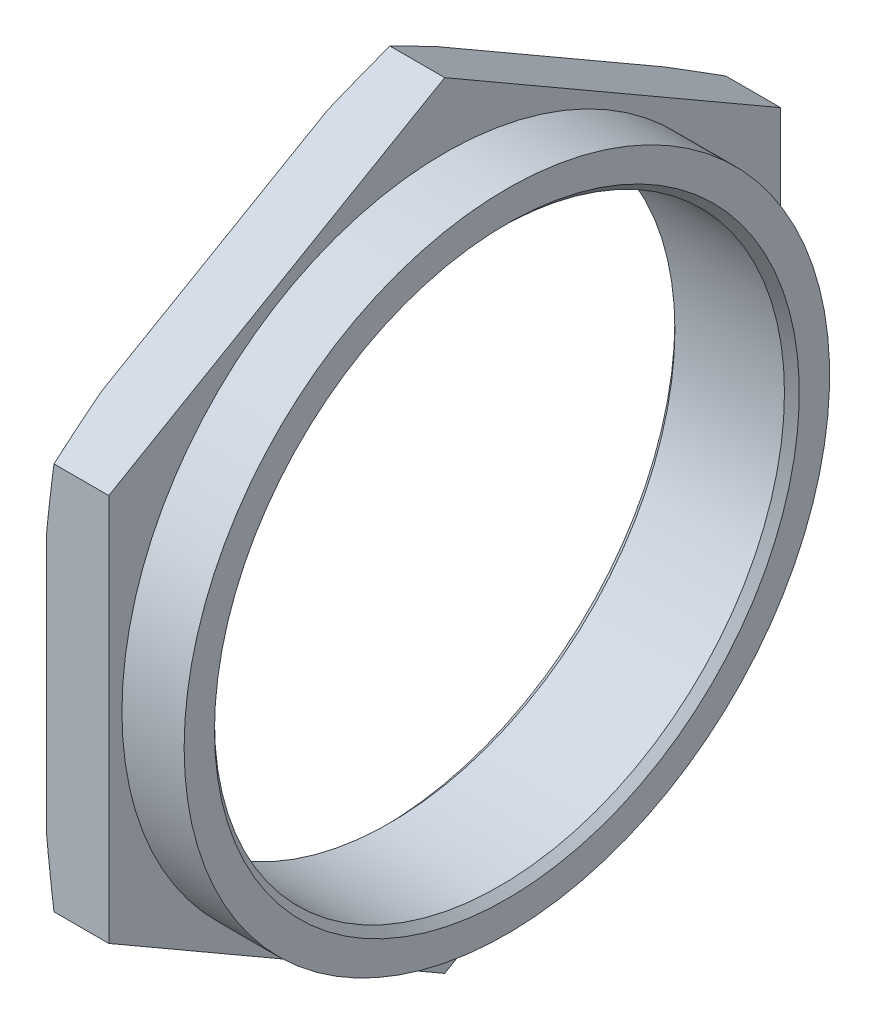
ISO-10303-21;
HEADER;
FILE_DESCRIPTION(('STEP AP214'),'2;1');
FILE_NAME('part.step','',(''),(''),'','','');
FILE_SCHEMA(('AUTOMOTIVE_DESIGN { 1 0 10303 214 1 1 1 1 }'));
ENDSEC;
DATA;
#1=APPLICATION_CONTEXT('core data for automotive mechanical design processes');
#2=APPLICATION_PROTOCOL_DEFINITION('international standard','automotive_design',2000,#1);
#3=PRODUCT_CONTEXT('',#1,'mechanical');
#4=PRODUCT('Part','Part','',(#3));
#5=PRODUCT_RELATED_PRODUCT_CATEGORY('part','',(#4));
#6=PRODUCT_DEFINITION_FORMATION('','',#4);
#7=PRODUCT_DEFINITION_CONTEXT('part definition',#1,'design');
#8=PRODUCT_DEFINITION('design','',#6,#7);
#9=PRODUCT_DEFINITION_SHAPE('','',#8);
#10=(LENGTH_UNIT() NAMED_UNIT(*) SI_UNIT(.MILLI.,.METRE.));
#11=(NAMED_UNIT(*) PLANE_ANGLE_UNIT() SI_UNIT($,.RADIAN.));
#12=(NAMED_UNIT(*) SI_UNIT($,.STERADIAN.) SOLID_ANGLE_UNIT());
#13=UNCERTAINTY_MEASURE_WITH_UNIT(LENGTH_MEASURE(1.E-05),#10,'distance_accuracy_value','');
#14=(GEOMETRIC_REPRESENTATION_CONTEXT(3) GLOBAL_UNCERTAINTY_ASSIGNED_CONTEXT((#13)) GLOBAL_UNIT_ASSIGNED_CONTEXT((#10,
#11,#12)) REPRESENTATION_CONTEXT('',''));
#15=CARTESIAN_POINT('',(0.,0.,0.));
#16=DIRECTION('',(0.,0.,1.));
#17=DIRECTION('',(1.,0.,0.));
#18=AXIS2_PLACEMENT_3D('',#15,#16,#17);
#19=CARTESIAN_POINT('',(0.,19.25,0.));
#20=DIRECTION('',(1.,0.,0.));
#21=DIRECTION('',(0.,0.,-1.));
#22=AXIS2_PLACEMENT_3D('',#19,#20,#21);
#23=PLANE('',#22);
#24=CARTESIAN_POINT('',(0.,0.,0.));
#25=DIRECTION('',(1.,0.,0.));
#26=DIRECTION('',(0.,0.,-1.));
#27=AXIS2_PLACEMENT_3D('',#24,#25,#26);
#28=CIRCLE('',#27,19.75);
#29=CARTESIAN_POINT('',(0.,0.,-19.75));
#30=VERTEX_POINT('',#29);
#31=EDGE_CURVE('E11',#30,#30,#28,.T.);
#32=ORIENTED_EDGE('',*,*,#31,.T.);
#33=EDGE_LOOP('',(#32));
#34=FACE_BOUND('',#33,.T.);
#35=DIRECTION('',(0.,0.5,-0.866025403784439));
#36=VECTOR('',#35,1.);
#37=CARTESIAN_POINT('',(0.,13.1,22.6898655791523));
#38=LINE('',#37,#36);
#39=CARTESIAN_POINT('',(0.,15.2536287790592,18.9596711131792));
#40=VERTEX_POINT('',#39);
#41=CARTESIAN_POINT('',(0.,24.0463712209408,3.73019446597312));
#42=VERTEX_POINT('',#41);
#43=EDGE_CURVE('E140',#40,#42,#38,.T.);
#44=ORIENTED_EDGE('',*,*,#43,.T.);
#45=CARTESIAN_POINT('',(0.,0.,0.));
#46=DIRECTION('',(1.,0.,0.));
#47=DIRECTION('',(0.,0.,-1.));
#48=AXIS2_PLACEMENT_3D('',#45,#46,#47);
#49=CIRCLE('',#48,24.3339745962156);
#50=CARTESIAN_POINT('',(0.,24.0463712209408,-3.73019446597313));
#51=VERTEX_POINT('',#50);
#52=EDGE_CURVE('E146',#42,#51,#49,.F.);
#53=ORIENTED_EDGE('',*,*,#52,.T.);
#54=DIRECTION('',(0.,-0.5,-0.866025403784439));
#55=VECTOR('',#54,1.);
#56=CARTESIAN_POINT('',(0.,26.2,0.));
#57=LINE('',#56,#55);
#58=CARTESIAN_POINT('',(0.,15.2536287790593,-18.9596711131792));
#59=VERTEX_POINT('',#58);
#60=EDGE_CURVE('E129',#51,#59,#57,.T.);
#61=ORIENTED_EDGE('',*,*,#60,.T.);
#62=CARTESIAN_POINT('',(0.,8.79274244188153,-22.6898655791523));
#63=VERTEX_POINT('',#62);
#64=EDGE_CURVE('E153',#59,#63,#49,.F.);
#65=ORIENTED_EDGE('',*,*,#64,.T.);
#66=DIRECTION('',(0.,-1.,0.));
#67=VECTOR('',#66,1.);
#68=CARTESIAN_POINT('',(0.,13.1,-22.6898655791523));
#69=LINE('',#68,#67);
#70=CARTESIAN_POINT('',(0.,-8.79274244188154,-22.6898655791523));
#71=VERTEX_POINT('',#70);
#72=EDGE_CURVE('E139',#63,#71,#69,.T.);
#73=ORIENTED_EDGE('',*,*,#72,.T.);
#74=CARTESIAN_POINT('',(0.,-15.2536287790592,-18.9596711131792));
#75=VERTEX_POINT('',#74);
#76=EDGE_CURVE('E157',#71,#75,#49,.F.);
#77=ORIENTED_EDGE('',*,*,#76,.T.);
#78=DIRECTION('',(0.,-0.5,0.866025403784439));
#79=VECTOR('',#78,1.);
#80=CARTESIAN_POINT('',(0.,-13.1,-22.6898655791523));
#81=LINE('',#80,#79);
#82=CARTESIAN_POINT('',(0.,-24.0463712209408,-3.73019446597311));
#83=VERTEX_POINT('',#82);
#84=EDGE_CURVE('E292',#75,#83,#81,.T.);
#85=ORIENTED_EDGE('',*,*,#84,.T.);
#86=CARTESIAN_POINT('',(0.,-24.0463712209408,3.73019446597317));
#87=VERTEX_POINT('',#86);
#88=EDGE_CURVE('E160',#83,#87,#49,.F.);
#89=ORIENTED_EDGE('',*,*,#88,.T.);
#90=DIRECTION('',(0.,0.5,0.866025403784439));
#91=VECTOR('',#90,1.);
#92=CARTESIAN_POINT('',(0.,-26.2,0.));
#93=LINE('',#92,#91);
#94=CARTESIAN_POINT('',(0.,-15.2536287790593,18.9596711131791));
#95=VERTEX_POINT('',#94);
#96=EDGE_CURVE('E289',#87,#95,#93,.T.);
#97=ORIENTED_EDGE('',*,*,#96,.T.);
#98=CARTESIAN_POINT('',(0.,-8.7927424418815,22.6898655791523));
#99=VERTEX_POINT('',#98);
#100=EDGE_CURVE('E155',#95,#99,#49,.F.);
#101=ORIENTED_EDGE('',*,*,#100,.T.);
#102=DIRECTION('',(0.,1.,0.));
#103=VECTOR('',#102,1.);
#104=CARTESIAN_POINT('',(0.,-13.1,22.6898655791523));
#105=LINE('',#104,#103);
#106=CARTESIAN_POINT('',(0.,8.79274244188152,22.6898655791523));
#107=VERTEX_POINT('',#106);
#108=EDGE_CURVE('E274',#99,#107,#105,.T.);
#109=ORIENTED_EDGE('',*,*,#108,.T.);
#110=EDGE_CURVE('E152',#107,#40,#49,.F.);
#111=ORIENTED_EDGE('',*,*,#110,.T.);
#112=EDGE_LOOP('',(#44,#53,#61,#65,#73,#77,#85,#89,#97,#101,#109,#111));
#113=FACE_BOUND('',#112,.T.);
#114=ADVANCED_FACE('F43',(#34,#113),#23,.F.);
#115=CARTESIAN_POINT('',(4.2,26.2,0.));
#116=DIRECTION('',(-1.,0.,0.));
#117=DIRECTION('',(0.,0.,1.));
#118=AXIS2_PLACEMENT_3D('',#115,#116,#117);
#119=PLANE('',#118);
#120=CARTESIAN_POINT('',(4.2,0.,0.));
#121=DIRECTION('',(-1.,0.,0.));
#122=DIRECTION('',(0.,0.,1.));
#123=AXIS2_PLACEMENT_3D('',#120,#121,#122);
#124=CIRCLE('',#123,21.8);
#125=CARTESIAN_POINT('',(4.2,0.,21.8));
#126=VERTEX_POINT('',#125);
#127=EDGE_CURVE('E156',#126,#126,#124,.T.);
#128=ORIENTED_EDGE('',*,*,#127,.T.);
#129=EDGE_LOOP('',(#128));
#130=FACE_BOUND('',#129,.T.);
#131=DIRECTION('',(0.,0.5,-0.866025403784439));
#132=VECTOR('',#131,1.);
#133=CARTESIAN_POINT('',(4.2,26.2,0.));
#134=LINE('',#133,#132);
#135=CARTESIAN_POINT('',(4.2,13.1,22.6898655791523));
#136=VERTEX_POINT('',#135);
#137=CARTESIAN_POINT('',(4.2,26.2,0.));
#138=VERTEX_POINT('',#137);
#139=EDGE_CURVE('E258',#136,#138,#134,.T.);
#140=ORIENTED_EDGE('',*,*,#139,.F.);
#141=DIRECTION('',(0.,1.,0.));
#142=VECTOR('',#141,1.);
#143=CARTESIAN_POINT('',(4.2,26.2,22.6898655791523));
#144=LINE('',#143,#142);
#145=CARTESIAN_POINT('',(4.2,-13.1,22.6898655791523));
#146=VERTEX_POINT('',#145);
#147=EDGE_CURVE('E260',#146,#136,#144,.T.);
#148=ORIENTED_EDGE('',*,*,#147,.F.);
#149=DIRECTION('',(0.,0.5,0.866025403784439));
#150=VECTOR('',#149,1.);
#151=CARTESIAN_POINT('',(4.2,-13.1,22.6898655791523));
#152=LINE('',#151,#150);
#153=CARTESIAN_POINT('',(4.2,-26.2,0.));
#154=VERTEX_POINT('',#153);
#155=EDGE_CURVE('E264',#154,#146,#152,.T.);
#156=ORIENTED_EDGE('',*,*,#155,.F.);
#157=DIRECTION('',(0.,-0.5,0.866025403784439));
#158=VECTOR('',#157,1.);
#159=CARTESIAN_POINT('',(4.2,-13.1,-22.6898655791523));
#160=LINE('',#159,#158);
#161=CARTESIAN_POINT('',(4.2,-13.1,-22.6898655791523));
#162=VERTEX_POINT('',#161);
#163=EDGE_CURVE('E266',#162,#154,#160,.T.);
#164=ORIENTED_EDGE('',*,*,#163,.F.);
#165=DIRECTION('',(0.,-1.,0.));
#166=VECTOR('',#165,1.);
#167=CARTESIAN_POINT('',(4.2,26.2,-22.6898655791523));
#168=LINE('',#167,#166);
#169=CARTESIAN_POINT('',(4.2,13.1,-22.6898655791523));
#170=VERTEX_POINT('',#169);
#171=EDGE_CURVE('E268',#170,#162,#168,.T.);
#172=ORIENTED_EDGE('',*,*,#171,.F.);
#173=DIRECTION('',(0.,-0.5,-0.866025403784439));
#174=VECTOR('',#173,1.);
#175=CARTESIAN_POINT('',(4.2,26.2,0.));
#176=LINE('',#175,#174);
#177=EDGE_CURVE('E270',#138,#170,#176,.T.);
#178=ORIENTED_EDGE('',*,*,#177,.F.);
#179=EDGE_LOOP('',(#140,#148,#156,#164,#172,#178));
#180=FACE_BOUND('',#179,.T.);
#181=ADVANCED_FACE('F309',(#130,#180),#119,.F.);
#182=CARTESIAN_POINT('',(0.,0.,0.));
#183=DIRECTION('',(1.,0.,0.));
#184=DIRECTION('',(0.,0.,-1.));
#185=AXIS2_PLACEMENT_3D('',#182,#183,#184);
#186=CONICAL_SURFACE('',#185,24.3339745962156,1.30899693899574);
#187=CARTESIAN_POINT('',(3.30875226775506,-28.8230623348295,22.6898655791523));
#188=CARTESIAN_POINT('',(3.14562498386485,-28.0481224495224,22.6898655791523));
#189=CARTESIAN_POINT('',(2.98485376620692,-27.2726791755808,22.6898655791523));
#190=CARTESIAN_POINT('',(2.66895643430979,-25.720618153055,22.6898655791523));
#191=CARTESIAN_POINT('',(2.51383050658741,-24.9440003665469,22.6898655791523));
#192=CARTESIAN_POINT('',(2.21008451077505,-23.3890483121449,22.6898655791523));
#193=CARTESIAN_POINT('',(2.06146805028084,-22.6107133373853,22.6898655791523));
#194=CARTESIAN_POINT('',(1.77199801819375,-21.0526030577849,22.6898655791523));
#195=CARTESIAN_POINT('',(1.6311443897173,-20.2728277635415,22.6898655791523));
#196=CARTESIAN_POINT('',(1.35803154713893,-18.7086519953029,22.6898655791523));
#197=CARTESIAN_POINT('',(1.22580777126424,-17.9242453104612,22.6898655791523));
#198=CARTESIAN_POINT('',(0.972160527522488,-16.3536896891494,22.6898655791523));
#199=CARTESIAN_POINT('',(0.850736925967873,-15.5675407743684,22.6898655791523));
#200=CARTESIAN_POINT('',(0.620524925862089,-13.9934590755661,22.6898655791523));
#201=CARTESIAN_POINT('',(0.511735360270022,-13.2055264631756,22.6898655791523));
#202=CARTESIAN_POINT('',(0.308789470048078,-11.627767935231,22.6898655791523));
#203=CARTESIAN_POINT('',(0.214633106131106,-10.8379420247658,22.6898655791523));
#204=CARTESIAN_POINT('',(0.0447412000202069,-9.27194285710774,22.6898655791523));
#205=CARTESIAN_POINT('',(-0.0313189183478063,-8.49580507432279,22.6898655791523));
#206=CARTESIAN_POINT('',(-0.165408418088753,-6.94196210059237,22.6898655791523));
#207=CARTESIAN_POINT('',(-0.223437867085546,-6.16425691553643,22.6898655791523));
#208=CARTESIAN_POINT('',(-0.319761829745891,-4.60769401823076,22.6898655791523));
#209=CARTESIAN_POINT('',(-0.358058393574758,-3.82883643414621,22.6898655791523));
#210=CARTESIAN_POINT('',(-0.413682069960406,-2.27036845516894,22.6898655791523));
#211=CARTESIAN_POINT('',(-0.431009290178929,-1.49075806416189,22.6898655791523));
#212=CARTESIAN_POINT('',(-0.444083281421632,0.067035049854088,22.6898655791523));
#213=CARTESIAN_POINT('',(-0.439874556484706,0.845217395371613,22.6898655791523));
#214=CARTESIAN_POINT('',(-0.410126039122106,2.40117486781815,22.6898655791523));
#215=CARTESIAN_POINT('',(-0.384586101713633,3.17894999194342,22.6898655791523));
#216=CARTESIAN_POINT('',(-0.31303405527621,4.73360436450593,22.6898655791523));
#217=CARTESIAN_POINT('',(-0.267020467602077,5.51048354417266,22.6898655791523));
#218=CARTESIAN_POINT('',(-0.155958283094992,7.06285577263663,22.6898655791523));
#219=CARTESIAN_POINT('',(-0.0909099294660104,7.83834883901666,22.6898655791523));
#220=CARTESIAN_POINT('',(0.0631038989394401,9.45799498231925,22.6898655791523));
#221=CARTESIAN_POINT('',(0.153704264657564,10.3019916073601,22.6898655791523));
#222=CARTESIAN_POINT('',(0.352843027142527,11.9877540892915,22.6898655791523));
#223=CARTESIAN_POINT('',(0.461379501968594,12.8295201753865,22.6898655791523));
#224=CARTESIAN_POINT('',(0.693980219610518,14.5116631924838,22.6898655791523));
#225=CARTESIAN_POINT('',(0.818058372297978,15.3520381870962,22.6898655791523));
#226=CARTESIAN_POINT('',(1.07933792609234,17.030755661567,22.6898655791523));
#227=CARTESIAN_POINT('',(1.21653965935156,17.8690980894311,22.6898655791523));
#228=CARTESIAN_POINT('',(1.50366681528594,19.553628351629,22.6898655791523));
#229=CARTESIAN_POINT('',(1.65372166453327,20.3997940272163,22.6898655791523));
#230=CARTESIAN_POINT('',(1.96333587205915,22.0903796149972,22.6898655791523));
#231=CARTESIAN_POINT('',(2.12289524213887,22.9347995250218,22.6898655791523));
#232=CARTESIAN_POINT('',(2.44969930632636,24.6206524108854,22.6898655791523));
#233=CARTESIAN_POINT('',(2.61693044267853,25.4620880245715,22.6898655791523));
#234=CARTESIAN_POINT('',(2.95810775387473,27.1435664856606,22.6898655791523));
#235=CARTESIAN_POINT('',(3.1320536835413,27.9836093827502,22.6898655791523));
#236=CARTESIAN_POINT('',(3.30875226775505,28.8230623348295,22.6898655791523));
#237=B_SPLINE_CURVE_WITH_KNOTS('',3,(#187,#188,#189,#190,#191,#192,#193,#194,#195,#196,#197,
#198,#199,#200,#201,#202,#203,#204,#205,#206,#207,#208,#209,#210,#211,#212,#213,#214,#215,#216,
#217,#218,#219,#220,#221,#222,#223,#224,#225,#226,#227,#228,#229,#230,#231,#232,#233,#234,#235,
#236),.UNSPECIFIED.,.F.,.F.,(4,2,2,2,2,2,2,2,2,2,2,2,2,2,2,2,2,2,2,2,2,2,2,2,4),(0.,
2.37577674749657,4.75163191802631,7.1287875623568,9.50592578533144,11.8922802943385,
14.2786052602734,16.6647096191328,19.0508075716887,21.3901867283751,23.7295571111354,
26.0686843939368,28.4077996670352,30.7420831121189,33.0763824228593,35.410850348418,
37.7452884481788,40.2916003190181,42.8376395169469,45.3859739354358,47.9343728682718,
50.5124116979102,53.0904537286099,55.6641031941378,58.2376587766415),.UNSPECIFIED.);
#238=CARTESIAN_POINT('',(0.500000000000006,13.1,22.6898655791523));
#239=VERTEX_POINT('',#238);
#240=EDGE_CURVE('E234',#107,#239,#237,.T.);
#241=ORIENTED_EDGE('',*,*,#240,.T.);
#242=CARTESIAN_POINT('',(3.82871784772698,4.02228572850094,38.4129279139818));
#243=CARTESIAN_POINT('',(3.65210757134718,4.42959734258843,37.7074435038694));
#244=CARTESIAN_POINT('',(3.47771713264086,4.83715287813356,37.0015366093993));
#245=CARTESIAN_POINT('',(3.13429097061315,5.65283909180315,35.58872664429));
#246=CARTESIAN_POINT('',(2.96525539884463,6.06096978586486,34.8818235460468));
#247=CARTESIAN_POINT('',(2.63338588604801,6.8780631665489,33.4665762961738));
#248=CARTESIAN_POINT('',(2.470554906546,7.28702615471474,32.7582316222554));
#249=CARTESIAN_POINT('',(2.15234037848628,8.10567510513992,31.3402900465561));
#250=CARTESIAN_POINT('',(1.99695678445147,8.51536106296862,30.6306931524492));
#251=CARTESIAN_POINT('',(1.69424411478872,9.33763745505877,29.2064686634847));
#252=CARTESIAN_POINT('',(1.5469601136748,9.75023205216623,28.4918338583661));
#253=CARTESIAN_POINT('',(1.26297167174767,10.5763304571209,27.060989448933));
#254=CARTESIAN_POINT('',(1.12626713317115,10.98983425653,26.3447798592337));
#255=CARTESIAN_POINT('',(0.865385025984676,11.8178147922721,24.9106755036502));
#256=CARTESIAN_POINT('',(0.741206894825473,12.2322914840573,24.1927808149253));
#257=CARTESIAN_POINT('',(0.50757978993861,13.0622875640039,22.7551854343748));
#258=CARTESIAN_POINT('',(0.398130785241059,13.477806949971,22.0354847463498));
#259=CARTESIAN_POINT('',(0.198521269563932,14.3010253873905,20.6096285870118));
#260=CARTESIAN_POINT('',(0.107999384993813,14.7087023701951,19.903511339718));
#261=CARTESIAN_POINT('',(-0.0543118612913282,15.5249851265728,18.4896681323293));
#262=CARTESIAN_POINT('',(-0.126101729934162,15.9335908747098,17.7819422162913));
#263=CARTESIAN_POINT('',(-0.248780209106063,16.7515368280784,16.3652182672117));
#264=CARTESIAN_POINT('',(-0.299671746440896,17.1608769223944,15.6562204262813));
#265=CARTESIAN_POINT('',(-0.37882253913249,17.980107363832,14.2372716786043));
#266=CARTESIAN_POINT('',(-0.40708195812067,18.3899977069537,13.5273207787857));
#267=CARTESIAN_POINT('',(-0.439871290083673,19.2089710541338,12.108817331425));
#268=CARTESIAN_POINT('',(-0.444461633423559,19.6180534459354,11.4002658443428));
#269=CARTESIAN_POINT('',(-0.429898893385493,20.4361135423835,9.98334419365004));
#270=CARTESIAN_POINT('',(-0.410745671887274,20.8450912464071,9.27497403111828));
#271=CARTESIAN_POINT('',(-0.349419034406269,21.6626474731346,7.85892510838188));
#272=CARTESIAN_POINT('',(-0.307243510291737,22.0712259558493,7.15124641744056));
#273=CARTESIAN_POINT('',(-0.201368904168765,22.8876717175536,5.73712087654445));
#274=CARTESIAN_POINT('',(-0.137670055727334,23.2955390042127,5.03067401330571));
#275=CARTESIAN_POINT('',(0.0230279392089484,24.1868804702869,3.48682530717234));
#276=CARTESIAN_POINT('',(0.124033743691549,24.670173195565,2.64973775206215));
#277=CARTESIAN_POINT('',(0.349745218317931,25.6353008103163,0.978087687525195));
#278=CARTESIAN_POINT('',(0.474448301560229,26.1171358530892,0.143524912575306));
#279=CARTESIAN_POINT('',(0.743955890456214,27.0800436738462,-1.52428035598118));
#280=CARTESIAN_POINT('',(0.888787055530048,27.5611145706702,-2.35751959132306));
#281=CARTESIAN_POINT('',(1.19498631722499,28.5219412616155,-4.02172023730857));
#282=CARTESIAN_POINT('',(1.35635481526814,29.0016970235232,-4.85268159215671));
#283=CARTESIAN_POINT('',(1.6949816561878,29.9665911134047,-6.52392717975434));
#284=CARTESIAN_POINT('',(1.87242778253823,30.4517128794113,-7.36418272633534));
#285=CARTESIAN_POINT('',(2.23872775531074,31.4208750847303,-9.04282090672327));
#286=CARTESIAN_POINT('',(2.42758163372155,31.9049155210065,-9.88120353527147));
#287=CARTESIAN_POINT('',(2.81415697081784,32.8708832949193,-11.5543087981627));
#288=CARTESIAN_POINT('',(3.01185574213416,33.3528129085857,-12.389035374705));
#289=CARTESIAN_POINT('',(3.31413511764861,34.0750942545514,-13.6400633632767));
#290=CARTESIAN_POINT('',(3.41584791619102,34.3157474762754,-14.0568869703078));
#291=CARTESIAN_POINT('',(3.62101705029152,34.7968670177072,-14.8902104605819));
#292=CARTESIAN_POINT('',(3.72447337839059,35.03733333821,-15.3067103452019));
#293=CARTESIAN_POINT('',(3.82871784772698,35.2777142714991,-15.7230623348295));
#294=B_SPLINE_CURVE_WITH_KNOTS('',3,(#242,#243,#244,#245,#246,#247,#248,#249,#250,#251,#252,
#253,#254,#255,#256,#257,#258,#259,#260,#261,#262,#263,#264,#265,#266,#267,#268,#269,#270,#271,
#272,#273,#274,#275,#276,#277,#278,#279,#280,#281,#282,#283,#284,#285,#286,#287,#288,#289,#290,
#291,#292,#293),.UNSPECIFIED.,.F.,.F.,(4,2,2,2,2,2,2,2,2,2,2,2,2,2,2,2,2,2,2,2,2,2,2,2,2,4),(0.,
2.50065036687393,5.00137144376868,7.50327156289577,10.0051564023443,12.5197891591492,
15.0343986758118,17.5488952133889,20.0633864638297,22.524287312421,24.9851215569426,
27.4456110446442,29.9060827427153,32.3602694007742,34.8144703353121,37.2688960365511,
39.7232951036858,42.6384854680324,45.553357779717,48.4721282686047,51.3909696236004,
54.3498958277316,57.308830329442,60.260567367772,61.7363738974714,63.212174115093),.UNSPECIFIED.);
#295=EDGE_CURVE('E199',#239,#40,#294,.T.);
#296=ORIENTED_EDGE('',*,*,#295,.T.);
#297=ORIENTED_EDGE('',*,*,#110,.F.);
#298=EDGE_LOOP('',(#241,#296,#297));
#299=FACE_BOUND('',#298,.T.);
#300=ADVANCED_FACE('F175',(#299),#186,.T.);
#301=CARTESIAN_POINT('',(3.82871784772698,-35.2777142714991,-15.7230623348295));
#302=CARTESIAN_POINT('',(3.65210757134718,-34.8704026574116,-15.017577924717));
#303=CARTESIAN_POINT('',(3.47771713264085,-34.4628471218665,-14.3116710302469));
#304=CARTESIAN_POINT('',(3.13429097061315,-33.6471609081969,-12.8988610651377));
#305=CARTESIAN_POINT('',(2.96525539884463,-33.2390302141352,-12.1919579668945));
#306=CARTESIAN_POINT('',(2.63338588604801,-32.4219368334511,-10.7767107170215));
#307=CARTESIAN_POINT('',(2.470554906546,-32.0129738452853,-10.0683660431031));
#308=CARTESIAN_POINT('',(2.15234037848628,-31.1943248948601,-8.65042446740375));
#309=CARTESIAN_POINT('',(1.99695678445147,-30.7846389370314,-7.9408275732969));
#310=CARTESIAN_POINT('',(1.69424411478872,-29.9623625449413,-6.51660308433235));
#311=CARTESIAN_POINT('',(1.5469601136748,-29.5497679478338,-5.80196827921381));
#312=CARTESIAN_POINT('',(1.26297167174767,-28.7236695428791,-4.37112386978068));
#313=CARTESIAN_POINT('',(1.12626713317115,-28.31016574347,-3.65491428008136));
#314=CARTESIAN_POINT('',(0.865385025984676,-27.4821852077279,-2.22080992449793));
#315=CARTESIAN_POINT('',(0.741206894825474,-27.0677085159427,-1.50291523577299));
#316=CARTESIAN_POINT('',(0.507579789938611,-26.2377124359961,-0.0653198552224781));
#317=CARTESIAN_POINT('',(0.398130785241061,-25.822193050029,0.654380832802499));
#318=CARTESIAN_POINT('',(0.198521269563934,-24.9989746126095,2.08023699214052));
#319=CARTESIAN_POINT('',(0.107999384993816,-24.591297629805,2.78635423943432));
#320=CARTESIAN_POINT('',(-0.0543118612913253,-23.7750148734272,4.200197446823));
#321=CARTESIAN_POINT('',(-0.126101729934159,-23.3664091252902,4.90792336286099));
#322=CARTESIAN_POINT('',(-0.24878020910606,-22.5484631719217,6.32464731194062));
#323=CARTESIAN_POINT('',(-0.299671746440893,-22.1391230776056,7.03364515287105));
#324=CARTESIAN_POINT('',(-0.378822539132486,-21.3198926361681,8.45259390054798));
#325=CARTESIAN_POINT('',(-0.407081958120667,-20.9100022930463,9.16254480036664));
#326=CARTESIAN_POINT('',(-0.43987129008367,-20.0910289458662,10.5810482477273));
#327=CARTESIAN_POINT('',(-0.444461633423557,-19.6819465540646,11.2895997348095));
#328=CARTESIAN_POINT('',(-0.42989889338549,-18.8638864576165,12.7065213855023));
#329=CARTESIAN_POINT('',(-0.41074567188727,-18.4549087535929,13.414891548034));
#330=CARTESIAN_POINT('',(-0.349419034406264,-17.6373525268654,14.8309404707704));
#331=CARTESIAN_POINT('',(-0.307243510291733,-17.2287740441507,15.5386191617117));
#332=CARTESIAN_POINT('',(-0.201368904168761,-16.4123282824464,16.9527447026079));
#333=CARTESIAN_POINT('',(-0.13767005572733,-16.0044609957873,17.6591915658466));
#334=CARTESIAN_POINT('',(0.0230279392089527,-15.1131195297132,19.20304027198));
#335=CARTESIAN_POINT('',(0.124033743691554,-14.629826804435,20.0401278270902));
#336=CARTESIAN_POINT('',(0.349745218317936,-13.6646991896837,21.7117778916271));
#337=CARTESIAN_POINT('',(0.474448301560233,-13.1828641469108,22.546340666577));
#338=CARTESIAN_POINT('',(0.743955890456217,-12.2199563261538,24.2141459351335));
#339=CARTESIAN_POINT('',(0.888787055530051,-11.7388854293298,25.0473851704754));
#340=CARTESIAN_POINT('',(1.194986317225,-10.7780587383845,26.7115858164609));
#341=CARTESIAN_POINT('',(1.35635481526814,-10.2983029764768,27.542547171309));
#342=CARTESIAN_POINT('',(1.6949816561878,-9.33340888659532,29.2137927589066));
#343=CARTESIAN_POINT('',(1.87242778253824,-8.8482871205887,30.0540483054876));
#344=CARTESIAN_POINT('',(2.23872775531074,-7.87912491526975,31.7326864858756));
#345=CARTESIAN_POINT('',(2.42758163372155,-7.39508447899354,32.5710691144238));
#346=CARTESIAN_POINT('',(2.81415697081784,-6.42911670508069,34.244174377315));
#347=CARTESIAN_POINT('',(3.01185574213416,-5.94718709141426,35.0789009538573));
#348=CARTESIAN_POINT('',(3.31413511764862,-5.22490574544864,36.329928942429));
#349=CARTESIAN_POINT('',(3.41584791619102,-4.98425252372466,36.7467525494601));
#350=CARTESIAN_POINT('',(3.62101705029152,-4.50313298229285,37.5800760397342));
#351=CARTESIAN_POINT('',(3.72447337839059,-4.26266666179005,37.9965759243542));
#352=CARTESIAN_POINT('',(3.82871784772698,-4.02228572850094,38.4129279139818));
#353=B_SPLINE_CURVE_WITH_KNOTS('',3,(#301,#302,#303,#304,#305,#306,#307,#308,#309,#310,#311,
#312,#313,#314,#315,#316,#317,#318,#319,#320,#321,#322,#323,#324,#325,#326,#327,#328,#329,#330,
#331,#332,#333,#334,#335,#336,#337,#338,#339,#340,#341,#342,#343,#344,#345,#346,#347,#348,#349,
#350,#351,#352),.UNSPECIFIED.,.F.,.F.,(4,2,2,2,2,2,2,2,2,2,2,2,2,2,2,2,2,2,2,2,2,2,2,2,2,4),(0.,
2.50065036687393,5.00137144376868,7.50327156289578,10.0051564023443,12.5197891591492,
15.0343986758117,17.5488952133889,20.0633864638297,22.524287312421,24.9851215569425,
27.4456110446442,29.9060827427153,32.3602694007742,34.8144703353121,37.2688960365511,
39.7232951036858,42.6384854680324,45.5533577797169,48.4721282686047,51.3909696236004,
54.3498958277316,57.308830329442,60.260567367772,61.7363738974713,63.212174115093),.UNSPECIFIED.);
#354=CARTESIAN_POINT('',(0.500000000000008,-13.1,22.6898655791523));
#355=VERTEX_POINT('',#354);
#356=EDGE_CURVE('E235',#95,#355,#353,.T.);
#357=ORIENTED_EDGE('',*,*,#356,.T.);
#358=EDGE_CURVE('E227',#355,#99,#237,.T.);
#359=ORIENTED_EDGE('',*,*,#358,.T.);
#360=ORIENTED_EDGE('',*,*,#100,.F.);
#361=EDGE_LOOP('',(#357,#359,#360));
#362=FACE_BOUND('',#361,.T.);
#363=ADVANCED_FACE('F325',(#362),#186,.T.);
#364=CARTESIAN_POINT('',(3.82871784772698,-4.02228572850093,-38.4129279139818));
#365=CARTESIAN_POINT('',(3.65210757134718,-4.42959734258842,-37.7074435038694));
#366=CARTESIAN_POINT('',(3.47771713264086,-4.83715287813355,-37.0015366093993));
#367=CARTESIAN_POINT('',(3.13429097061315,-5.65283909180314,-35.58872664429));
#368=CARTESIAN_POINT('',(2.96525539884464,-6.06096978586485,-34.8818235460468));
#369=CARTESIAN_POINT('',(2.63338588604801,-6.87806316654889,-33.4665762961738));
#370=CARTESIAN_POINT('',(2.470554906546,-7.28702615471473,-32.7582316222554));
#371=CARTESIAN_POINT('',(2.15234037848628,-8.10567510513991,-31.3402900465561));
#372=CARTESIAN_POINT('',(1.99695678445147,-8.51536106296862,-30.6306931524492));
#373=CARTESIAN_POINT('',(1.69424411478872,-9.33763745505876,-29.2064686634847));
#374=CARTESIAN_POINT('',(1.5469601136748,-9.75023205216623,-28.4918338583661));
#375=CARTESIAN_POINT('',(1.26297167174767,-10.5763304571209,-27.060989448933));
#376=CARTESIAN_POINT('',(1.12626713317115,-10.98983425653,-26.3447798592337));
#377=CARTESIAN_POINT('',(0.865385025984674,-11.8178147922721,-24.9106755036502));
#378=CARTESIAN_POINT('',(0.741206894825472,-12.2322914840573,-24.1927808149253));
#379=CARTESIAN_POINT('',(0.507579789938608,-13.0622875640039,-22.7551854343748));
#380=CARTESIAN_POINT('',(0.398130785241057,-13.477806949971,-22.0354847463498));
#381=CARTESIAN_POINT('',(0.19852126956393,-14.3010253873905,-20.6096285870118));
#382=CARTESIAN_POINT('',(0.107999384993812,-14.708702370195,-19.903511339718));
#383=CARTESIAN_POINT('',(-0.0543118612913291,-15.5249851265728,-18.4896681323293));
#384=CARTESIAN_POINT('',(-0.126101729934164,-15.9335908747098,-17.7819422162913));
#385=CARTESIAN_POINT('',(-0.248780209106064,-16.7515368280783,-16.3652182672117));
#386=CARTESIAN_POINT('',(-0.299671746440898,-17.1608769223944,-15.6562204262813));
#387=CARTESIAN_POINT('',(-0.378822539132491,-17.980107363832,-14.2372716786043));
#388=CARTESIAN_POINT('',(-0.407081958120672,-18.3899977069537,-13.5273207787857));
#389=CARTESIAN_POINT('',(-0.439871290083675,-19.2089710541338,-12.108817331425));
#390=CARTESIAN_POINT('',(-0.444461633423561,-19.6180534459354,-11.4002658443428));
#391=CARTESIAN_POINT('',(-0.429898893385494,-20.4361135423835,-9.98334419365005));
#392=CARTESIAN_POINT('',(-0.410745671887275,-20.8450912464071,-9.27497403111828));
#393=CARTESIAN_POINT('',(-0.34941903440627,-21.6626474731346,-7.85892510838188));
#394=CARTESIAN_POINT('',(-0.307243510291739,-22.0712259558493,-7.15124641744056));
#395=CARTESIAN_POINT('',(-0.201368904168767,-22.8876717175536,-5.73712087654445));
#396=CARTESIAN_POINT('',(-0.137670055727336,-23.2955390042127,-5.03067401330571));
#397=CARTESIAN_POINT('',(0.0230279392089468,-24.1868804702868,-3.48682530717234));
#398=CARTESIAN_POINT('',(0.124033743691548,-24.670173195565,-2.64973775206215));
#399=CARTESIAN_POINT('',(0.349745218317931,-25.6353008103163,-0.978087687525192));
#400=CARTESIAN_POINT('',(0.474448301560229,-26.1171358530892,-0.143524912575302));
#401=CARTESIAN_POINT('',(0.743955890456214,-27.0800436738462,1.52428035598119));
#402=CARTESIAN_POINT('',(0.888787055530048,-27.5611145706702,2.35751959132307));
#403=CARTESIAN_POINT('',(1.19498631722499,-28.5219412616155,4.02172023730858));
#404=CARTESIAN_POINT('',(1.35635481526814,-29.0016970235232,4.85268159215672));
#405=CARTESIAN_POINT('',(1.6949816561878,-29.9665911134047,6.52392717975435));
#406=CARTESIAN_POINT('',(1.87242778253824,-30.4517128794113,7.36418272633536));
#407=CARTESIAN_POINT('',(2.23872775531074,-31.4208750847303,9.04282090672329));
#408=CARTESIAN_POINT('',(2.42758163372156,-31.9049155210065,9.88120353527149));
#409=CARTESIAN_POINT('',(2.81415697081784,-32.8708832949193,11.5543087981628));
#410=CARTESIAN_POINT('',(3.01185574213416,-33.3528129085858,12.3890353747051));
#411=CARTESIAN_POINT('',(3.31413511764862,-34.0750942545514,13.6400633632767));
#412=CARTESIAN_POINT('',(3.41584791619102,-34.3157474762754,14.0568869703078));
#413=CARTESIAN_POINT('',(3.62101705029153,-34.7968670177072,14.890210460582));
#414=CARTESIAN_POINT('',(3.72447337839059,-35.03733333821,15.306710345202));
#415=CARTESIAN_POINT('',(3.82871784772699,-35.2777142714991,15.7230623348295));
#416=B_SPLINE_CURVE_WITH_KNOTS('',3,(#364,#365,#366,#367,#368,#369,#370,#371,#372,#373,#374,
#375,#376,#377,#378,#379,#380,#381,#382,#383,#384,#385,#386,#387,#388,#389,#390,#391,#392,#393,
#394,#395,#396,#397,#398,#399,#400,#401,#402,#403,#404,#405,#406,#407,#408,#409,#410,#411,#412,
#413,#414,#415),.UNSPECIFIED.,.F.,.F.,(4,2,2,2,2,2,2,2,2,2,2,2,2,2,2,2,2,2,2,2,2,2,2,2,2,4),(0.,
2.50065036687393,5.00137144376868,7.50327156289577,10.0051564023443,12.5197891591492,
15.0343986758118,17.5488952133889,20.0633864638297,22.524287312421,24.9851215569426,
27.4456110446442,29.9060827427153,32.3602694007742,34.8144703353122,37.2688960365511,
39.7232951036858,42.6384854680324,45.553357779717,48.4721282686047,51.3909696236004,
54.3498958277317,57.3088303294421,60.260567367772,61.7363738974714,63.2121741150931),.UNSPECIFIED.);
#417=CARTESIAN_POINT('',(0.500000000000006,-26.2,0.));
#418=VERTEX_POINT('',#417);
#419=EDGE_CURVE('E207',#83,#418,#416,.T.);
#420=ORIENTED_EDGE('',*,*,#419,.T.);
#421=EDGE_CURVE('E208',#418,#87,#353,.T.);
#422=ORIENTED_EDGE('',*,*,#421,.T.);
#423=ORIENTED_EDGE('',*,*,#88,.F.);
#424=EDGE_LOOP('',(#420,#422,#423));
#425=FACE_BOUND('',#424,.T.);
#426=ADVANCED_FACE('F320',(#425),#186,.T.);
#427=CARTESIAN_POINT('',(3.30875226775505,28.8230623348295,-22.6898655791523));
#428=CARTESIAN_POINT('',(3.14562498386485,28.0481224495224,-22.6898655791523));
#429=CARTESIAN_POINT('',(2.98485376620691,27.2726791755808,-22.6898655791523));
#430=CARTESIAN_POINT('',(2.66895643430978,25.720618153055,-22.6898655791523));
#431=CARTESIAN_POINT('',(2.51383050658741,24.9440003665469,-22.6898655791523));
#432=CARTESIAN_POINT('',(2.21008451077505,23.3890483121449,-22.6898655791523));
#433=CARTESIAN_POINT('',(2.06146805028084,22.6107133373853,-22.6898655791523));
#434=CARTESIAN_POINT('',(1.77199801819374,21.0526030577849,-22.6898655791523));
#435=CARTESIAN_POINT('',(1.6311443897173,20.2728277635415,-22.6898655791523));
#436=CARTESIAN_POINT('',(1.35803154713893,18.7086519953029,-22.6898655791523));
#437=CARTESIAN_POINT('',(1.22580777126423,17.9242453104612,-22.6898655791523));
#438=CARTESIAN_POINT('',(0.972160527522485,16.3536896891494,-22.6898655791523));
#439=CARTESIAN_POINT('',(0.850736925967871,15.5675407743684,-22.6898655791523));
#440=CARTESIAN_POINT('',(0.620524925862086,13.9934590755661,-22.6898655791523));
#441=CARTESIAN_POINT('',(0.511735360270019,13.2055264631756,-22.6898655791523));
#442=CARTESIAN_POINT('',(0.308789470048075,11.627767935231,-22.6898655791523));
#443=CARTESIAN_POINT('',(0.214633106131104,10.8379420247658,-22.6898655791523));
#444=CARTESIAN_POINT('',(0.044741200020205,9.27194285710774,-22.6898655791523));
#445=CARTESIAN_POINT('',(-0.0313189183478089,8.49580507432279,-22.6898655791523));
#446=CARTESIAN_POINT('',(-0.165408418088756,6.94196210059237,-22.6898655791523));
#447=CARTESIAN_POINT('',(-0.223437867085549,6.16425691553644,-22.6898655791523));
#448=CARTESIAN_POINT('',(-0.319761829745894,4.60769401823076,-22.6898655791523));
#449=CARTESIAN_POINT('',(-0.358058393574761,3.82883643414621,-22.6898655791523));
#450=CARTESIAN_POINT('',(-0.413682069960408,2.27036845516894,-22.6898655791523));
#451=CARTESIAN_POINT('',(-0.431009290178931,1.49075806416189,-22.6898655791523));
#452=CARTESIAN_POINT('',(-0.444083281421634,-0.0670350498540833,-22.6898655791523));
#453=CARTESIAN_POINT('',(-0.43987455648471,-0.845217395371608,-22.6898655791523));
#454=CARTESIAN_POINT('',(-0.410126039122109,-2.40117486781814,-22.6898655791523));
#455=CARTESIAN_POINT('',(-0.384586101713636,-3.17894999194342,-22.6898655791523));
#456=CARTESIAN_POINT('',(-0.313034055276212,-4.73360436450592,-22.6898655791523));
#457=CARTESIAN_POINT('',(-0.267020467602081,-5.51048354417265,-22.6898655791523));
#458=CARTESIAN_POINT('',(-0.155958283094995,-7.06285577263662,-22.6898655791523));
#459=CARTESIAN_POINT('',(-0.0909099294660132,-7.83834883901665,-22.6898655791523));
#460=CARTESIAN_POINT('',(0.0631038989394374,-9.45799498231924,-22.6898655791523));
#461=CARTESIAN_POINT('',(0.153704264657561,-10.3019916073601,-22.6898655791523));
#462=CARTESIAN_POINT('',(0.352843027142523,-11.9877540892915,-22.6898655791523));
#463=CARTESIAN_POINT('',(0.46137950196859,-12.8295201753865,-22.6898655791523));
#464=CARTESIAN_POINT('',(0.693980219610514,-14.5116631924838,-22.6898655791523));
#465=CARTESIAN_POINT('',(0.818058372297974,-15.3520381870962,-22.6898655791523));
#466=CARTESIAN_POINT('',(1.07933792609234,-17.030755661567,-22.6898655791523));
#467=CARTESIAN_POINT('',(1.21653965935155,-17.8690980894311,-22.6898655791523));
#468=CARTESIAN_POINT('',(1.50366681528594,-19.553628351629,-22.6898655791523));
#469=CARTESIAN_POINT('',(1.65372166453327,-20.3997940272163,-22.6898655791523));
#470=CARTESIAN_POINT('',(1.96333587205914,-22.0903796149972,-22.6898655791523));
#471=CARTESIAN_POINT('',(2.12289524213887,-22.9347995250218,-22.6898655791523));
#472=CARTESIAN_POINT('',(2.44969930632636,-24.6206524108854,-22.6898655791523));
#473=CARTESIAN_POINT('',(2.61693044267853,-25.4620880245715,-22.6898655791523));
#474=CARTESIAN_POINT('',(2.95810775387473,-27.1435664856606,-22.6898655791523));
#475=CARTESIAN_POINT('',(3.1320536835413,-27.9836093827502,-22.6898655791523));
#476=CARTESIAN_POINT('',(3.30875226775505,-28.8230623348295,-22.6898655791523));
#477=B_SPLINE_CURVE_WITH_KNOTS('',3,(#427,#428,#429,#430,#431,#432,#433,#434,#435,#436,#437,
#438,#439,#440,#441,#442,#443,#444,#445,#446,#447,#448,#449,#450,#451,#452,#453,#454,#455,#456,
#457,#458,#459,#460,#461,#462,#463,#464,#465,#466,#467,#468,#469,#470,#471,#472,#473,#474,#475,
#476),.UNSPECIFIED.,.F.,.F.,(4,2,2,2,2,2,2,2,2,2,2,2,2,2,2,2,2,2,2,2,2,2,2,2,4),(0.,
2.37577674749657,4.7516319180263,7.1287875623568,9.50592578533143,11.8922802943385,
14.2786052602734,16.6647096191328,19.0508075716887,21.3901867283751,23.7295571111354,
26.0686843939368,28.4077996670352,30.7420831121189,33.0763824228593,35.410850348418,
37.7452884481788,40.2916003190181,42.8376395169469,45.3859739354358,47.9343728682718,
50.5124116979102,53.0904537286099,55.6641031941377,58.2376587766415),.UNSPECIFIED.);
#478=CARTESIAN_POINT('',(0.500000000000002,-13.1,-22.6898655791523));
#479=VERTEX_POINT('',#478);
#480=EDGE_CURVE('E198',#71,#479,#477,.T.);
#481=ORIENTED_EDGE('',*,*,#480,.T.);
#482=EDGE_CURVE('E200',#479,#75,#416,.T.);
#483=ORIENTED_EDGE('',*,*,#482,.T.);
#484=ORIENTED_EDGE('',*,*,#76,.F.);
#485=EDGE_LOOP('',(#481,#483,#484));
#486=FACE_BOUND('',#485,.T.);
#487=ADVANCED_FACE('F302',(#486),#186,.T.);
#488=ORIENTED_EDGE('',*,*,#52,.F.);
#489=CARTESIAN_POINT('',(0.500000000000004,26.2,0.));
#490=VERTEX_POINT('',#489);
#491=EDGE_CURVE('E147',#42,#490,#294,.T.);
#492=ORIENTED_EDGE('',*,*,#491,.T.);
#493=CARTESIAN_POINT('',(3.82871784772698,35.2777142714991,15.7230623348295));
#494=CARTESIAN_POINT('',(3.65210757134718,34.8704026574116,15.0175779247171));
#495=CARTESIAN_POINT('',(3.47771713264085,34.4628471218665,14.311671030247));
#496=CARTESIAN_POINT('',(3.13429097061315,33.6471609081969,12.8988610651377));
#497=CARTESIAN_POINT('',(2.96525539884463,33.2390302141352,12.1919579668945));
#498=CARTESIAN_POINT('',(2.63338588604801,32.4219368334511,10.7767107170215));
#499=CARTESIAN_POINT('',(2.470554906546,32.0129738452853,10.0683660431031));
#500=CARTESIAN_POINT('',(2.15234037848628,31.1943248948601,8.65042446740378));
#501=CARTESIAN_POINT('',(1.99695678445147,30.7846389370314,7.94082757329693));
#502=CARTESIAN_POINT('',(1.69424411478872,29.9623625449412,6.51660308433238));
#503=CARTESIAN_POINT('',(1.5469601136748,29.5497679478338,5.80196827921384));
#504=CARTESIAN_POINT('',(1.26297167174767,28.7236695428791,4.3711238697807));
#505=CARTESIAN_POINT('',(1.12626713317115,28.31016574347,3.65491428008139));
#506=CARTESIAN_POINT('',(0.865385025984676,27.4821852077279,2.22080992449796));
#507=CARTESIAN_POINT('',(0.741206894825473,27.0677085159427,1.50291523577302));
#508=CARTESIAN_POINT('',(0.507579789938609,26.2377124359961,0.065319855222506));
#509=CARTESIAN_POINT('',(0.398130785241059,25.822193050029,-0.654380832802472));
#510=CARTESIAN_POINT('',(0.198521269563932,24.9989746126095,-2.0802369921405));
#511=CARTESIAN_POINT('',(0.107999384993813,24.591297629805,-2.78635423943429));
#512=CARTESIAN_POINT('',(-0.0543118612913282,23.7750148734272,-4.20019744682298));
#513=CARTESIAN_POINT('',(-0.126101729934162,23.3664091252902,-4.90792336286096));
#514=CARTESIAN_POINT('',(-0.248780209106062,22.5484631719217,-6.32464731194059));
#515=CARTESIAN_POINT('',(-0.299671746440896,22.1391230776056,-7.03364515287102));
#516=CARTESIAN_POINT('',(-0.378822539132489,21.3198926361681,-8.45259390054796));
#517=CARTESIAN_POINT('',(-0.407081958120669,20.9100022930463,-9.16254480036662));
#518=CARTESIAN_POINT('',(-0.439871290083673,20.0910289458662,-10.5810482477273));
#519=CARTESIAN_POINT('',(-0.44446163342356,19.6819465540646,-11.2895997348095));
#520=CARTESIAN_POINT('',(-0.429898893385494,18.8638864576166,-12.7065213855022));
#521=CARTESIAN_POINT('',(-0.410745671887274,18.4549087535929,-13.414891548034));
#522=CARTESIAN_POINT('',(-0.349419034406268,17.6373525268654,-14.8309404707704));
#523=CARTESIAN_POINT('',(-0.307243510291737,17.2287740441507,-15.5386191617117));
#524=CARTESIAN_POINT('',(-0.201368904168765,16.4123282824464,-16.9527447026078));
#525=CARTESIAN_POINT('',(-0.137670055727334,16.0044609957873,-17.6591915658466));
#526=CARTESIAN_POINT('',(0.0230279392089486,15.1131195297132,-19.20304027198));
#527=CARTESIAN_POINT('',(0.124033743691549,14.629826804435,-20.0401278270901));
#528=CARTESIAN_POINT('',(0.349745218317931,13.6646991896837,-21.7117778916271));
#529=CARTESIAN_POINT('',(0.474448301560229,13.1828641469108,-22.546340666577));
#530=CARTESIAN_POINT('',(0.743955890456214,12.2199563261538,-24.2141459351335));
#531=CARTESIAN_POINT('',(0.888787055530048,11.7388854293298,-25.0473851704753));
#532=CARTESIAN_POINT('',(1.19498631722499,10.7780587383845,-26.7115858164609));
#533=CARTESIAN_POINT('',(1.35635481526814,10.2983029764768,-27.542547171309));
#534=CARTESIAN_POINT('',(1.6949816561878,9.33340888659533,-29.2137927589066));
#535=CARTESIAN_POINT('',(1.87242778253824,8.84828712058871,-30.0540483054876));
#536=CARTESIAN_POINT('',(2.23872775531074,7.87912491526975,-31.7326864858756));
#537=CARTESIAN_POINT('',(2.42758163372155,7.39508447899354,-32.5710691144238));
#538=CARTESIAN_POINT('',(2.81415697081784,6.42911670508069,-34.244174377315));
#539=CARTESIAN_POINT('',(3.01185574213416,5.94718709141426,-35.0789009538573));
#540=CARTESIAN_POINT('',(3.31413511764862,5.22490574544864,-36.329928942429));
#541=CARTESIAN_POINT('',(3.41584791619102,4.98425252372466,-36.7467525494601));
#542=CARTESIAN_POINT('',(3.62101705029152,4.50313298229286,-37.5800760397342));
#543=CARTESIAN_POINT('',(3.72447337839059,4.26266666179005,-37.9965759243542));
#544=CARTESIAN_POINT('',(3.82871784772698,4.02228572850094,-38.4129279139818));
#545=B_SPLINE_CURVE_WITH_KNOTS('',3,(#493,#494,#495,#496,#497,#498,#499,#500,#501,#502,#503,
#504,#505,#506,#507,#508,#509,#510,#511,#512,#513,#514,#515,#516,#517,#518,#519,#520,#521,#522,
#523,#524,#525,#526,#527,#528,#529,#530,#531,#532,#533,#534,#535,#536,#537,#538,#539,#540,#541,
#542,#543,#544),.UNSPECIFIED.,.F.,.F.,(4,2,2,2,2,2,2,2,2,2,2,2,2,2,2,2,2,2,2,2,2,2,2,2,2,4),(0.,
2.50065036687392,5.00137144376868,7.50327156289577,10.0051564023443,12.5197891591492,
15.0343986758117,17.5488952133889,20.0633864638297,22.524287312421,24.9851215569425,
27.4456110446442,29.9060827427153,32.3602694007742,34.8144703353121,37.2688960365511,
39.7232951036858,42.6384854680324,45.5533577797169,48.4721282686047,51.3909696236004,
54.3498958277316,57.308830329442,60.260567367772,61.7363738974714,63.212174115093),.UNSPECIFIED.);
#546=EDGE_CURVE('E132',#490,#51,#545,.T.);
#547=ORIENTED_EDGE('',*,*,#546,.T.);
#548=EDGE_LOOP('',(#488,#492,#547));
#549=FACE_BOUND('',#548,.T.);
#550=ADVANCED_FACE('F145',(#549),#186,.T.);
#551=CARTESIAN_POINT('',(0.500000000000003,13.1,-22.6898655791523));
#552=VERTEX_POINT('',#551);
#553=EDGE_CURVE('E134',#59,#552,#545,.T.);
#554=ORIENTED_EDGE('',*,*,#553,.T.);
#555=EDGE_CURVE('E148',#552,#63,#477,.T.);
#556=ORIENTED_EDGE('',*,*,#555,.T.);
#557=ORIENTED_EDGE('',*,*,#64,.F.);
#558=EDGE_LOOP('',(#554,#556,#557));
#559=FACE_BOUND('',#558,.T.);
#560=ADVANCED_FACE('F331',(#559),#186,.T.);
#561=CARTESIAN_POINT('',(0.,0.,0.));
#562=DIRECTION('',(-1.,0.,0.));
#563=DIRECTION('',(0.,0.,1.));
#564=AXIS2_PLACEMENT_3D('',#561,#562,#563);
#565=CYLINDRICAL_SURFACE('',#564,19.25);
#566=CARTESIAN_POINT('',(7.9,0.,0.));
#567=DIRECTION('',(-1.,0.,0.));
#568=DIRECTION('',(0.,0.,1.));
#569=AXIS2_PLACEMENT_3D('',#566,#567,#568);
#570=CIRCLE('',#569,19.25);
#571=CARTESIAN_POINT('',(7.9,0.,19.25));
#572=VERTEX_POINT('',#571);
#573=EDGE_CURVE('E51',#572,#572,#570,.F.);
#574=ORIENTED_EDGE('',*,*,#573,.T.);
#575=EDGE_LOOP('',(#574));
#576=FACE_BOUND('',#575,.T.);
#577=CARTESIAN_POINT('',(0.500000000000014,0.,0.));
#578=DIRECTION('',(1.,0.,0.));
#579=DIRECTION('',(0.,0.,-1.));
#580=AXIS2_PLACEMENT_3D('',#577,#578,#579);
#581=CIRCLE('',#580,19.25);
#582=CARTESIAN_POINT('',(0.500000000000014,0.,-19.25));
#583=VERTEX_POINT('',#582);
#584=EDGE_CURVE('E239',#583,#583,#581,.F.);
#585=ORIENTED_EDGE('',*,*,#584,.T.);
#586=EDGE_LOOP('',(#585));
#587=FACE_BOUND('',#586,.T.);
#588=ADVANCED_FACE('F244',(#576,#587),#565,.F.);
#589=CARTESIAN_POINT('',(0.,0.,0.));
#590=DIRECTION('',(-1.,0.,0.));
#591=DIRECTION('',(0.,0.,1.));
#592=AXIS2_PLACEMENT_3D('',#589,#590,#591);
#593=CYLINDRICAL_SURFACE('',#592,21.8);
#594=ORIENTED_EDGE('',*,*,#127,.F.);
#595=EDGE_LOOP('',(#594));
#596=FACE_BOUND('',#595,.T.);
#597=CARTESIAN_POINT('',(8.4,0.,0.));
#598=DIRECTION('',(-1.,0.,0.));
#599=DIRECTION('',(0.,0.,1.));
#600=AXIS2_PLACEMENT_3D('',#597,#598,#599);
#601=CIRCLE('',#600,21.8);
#602=CARTESIAN_POINT('',(8.4,0.,21.8));
#603=VERTEX_POINT('',#602);
#604=EDGE_CURVE('E256',#603,#603,#601,.T.);
#605=ORIENTED_EDGE('',*,*,#604,.T.);
#606=EDGE_LOOP('',(#605));
#607=FACE_BOUND('',#606,.T.);
#608=ADVANCED_FACE('F253',(#596,#607),#593,.T.);
#609=CARTESIAN_POINT('',(8.4,21.8,0.));
#610=DIRECTION('',(-1.,0.,0.));
#611=DIRECTION('',(0.,0.,1.));
#612=AXIS2_PLACEMENT_3D('',#609,#610,#611);
#613=PLANE('',#612);
#614=CARTESIAN_POINT('',(8.4,0.,0.));
#615=DIRECTION('',(-1.,0.,0.));
#616=DIRECTION('',(0.,0.,1.));
#617=AXIS2_PLACEMENT_3D('',#614,#615,#616);
#618=CIRCLE('',#617,19.75);
#619=CARTESIAN_POINT('',(8.4,0.,19.75));
#620=VERTEX_POINT('',#619);
#621=EDGE_CURVE('E236',#620,#620,#618,.T.);
#622=ORIENTED_EDGE('',*,*,#621,.T.);
#623=EDGE_LOOP('',(#622));
#624=FACE_BOUND('',#623,.T.);
#625=ORIENTED_EDGE('',*,*,#604,.F.);
#626=EDGE_LOOP('',(#625));
#627=FACE_BOUND('',#626,.T.);
#628=ADVANCED_FACE('F190',(#624,#627),#613,.F.);
#629=CARTESIAN_POINT('',(8.4,13.1,22.6898655791523));
#630=DIRECTION('',(0.,0.866025403784439,0.5));
#631=DIRECTION('',(0.,-0.5,0.866025403784439));
#632=AXIS2_PLACEMENT_3D('',#629,#630,#631);
#633=PLANE('',#632);
#634=ORIENTED_EDGE('',*,*,#139,.T.);
#635=DIRECTION('',(-1.,0.,0.));
#636=VECTOR('',#635,1.);
#637=CARTESIAN_POINT('',(8.4,26.2,0.));
#638=LINE('',#637,#636);
#639=EDGE_CURVE('E58',#138,#490,#638,.T.);
#640=ORIENTED_EDGE('',*,*,#639,.T.);
#641=ORIENTED_EDGE('',*,*,#491,.F.);
#642=ORIENTED_EDGE('',*,*,#43,.F.);
#643=ORIENTED_EDGE('',*,*,#295,.F.);
#644=DIRECTION('',(-1.,0.,0.));
#645=VECTOR('',#644,1.);
#646=CARTESIAN_POINT('',(8.4,13.1,22.6898655791523));
#647=LINE('',#646,#645);
#648=EDGE_CURVE('E272',#136,#239,#647,.T.);
#649=ORIENTED_EDGE('',*,*,#648,.F.);
#650=EDGE_LOOP('',(#634,#640,#641,#642,#643,#649));
#651=FACE_BOUND('',#650,.T.);
#652=ADVANCED_FACE('F185',(#651),#633,.T.);
#653=CARTESIAN_POINT('',(8.4,-13.1,22.6898655791523));
#654=DIRECTION('',(0.,0.,1.));
#655=DIRECTION('',(0.,-1.,0.));
#656=AXIS2_PLACEMENT_3D('',#653,#654,#655);
#657=PLANE('',#656);
#658=ORIENTED_EDGE('',*,*,#147,.T.);
#659=ORIENTED_EDGE('',*,*,#648,.T.);
#660=ORIENTED_EDGE('',*,*,#240,.F.);
#661=ORIENTED_EDGE('',*,*,#108,.F.);
#662=ORIENTED_EDGE('',*,*,#358,.F.);
#663=DIRECTION('',(-1.,0.,0.));
#664=VECTOR('',#663,1.);
#665=CARTESIAN_POINT('',(8.4,-13.1,22.6898655791523));
#666=LINE('',#665,#664);
#667=EDGE_CURVE('E282',#146,#355,#666,.T.);
#668=ORIENTED_EDGE('',*,*,#667,.F.);
#669=EDGE_LOOP('',(#658,#659,#660,#661,#662,#668));
#670=FACE_BOUND('',#669,.T.);
#671=ADVANCED_FACE('F189',(#670),#657,.T.);
#672=CARTESIAN_POINT('',(8.4,-26.2,0.));
#673=DIRECTION('',(0.,-0.866025403784439,0.5));
#674=DIRECTION('',(0.,-0.5,-0.866025403784439));
#675=AXIS2_PLACEMENT_3D('',#672,#673,#674);
#676=PLANE('',#675);
#677=ORIENTED_EDGE('',*,*,#155,.T.);
#678=ORIENTED_EDGE('',*,*,#667,.T.);
#679=ORIENTED_EDGE('',*,*,#356,.F.);
#680=ORIENTED_EDGE('',*,*,#96,.F.);
#681=ORIENTED_EDGE('',*,*,#421,.F.);
#682=DIRECTION('',(-1.,0.,0.));
#683=VECTOR('',#682,1.);
#684=CARTESIAN_POINT('',(8.4,-26.2,0.));
#685=LINE('',#684,#683);
#686=EDGE_CURVE('E279',#154,#418,#685,.T.);
#687=ORIENTED_EDGE('',*,*,#686,.F.);
#688=EDGE_LOOP('',(#677,#678,#679,#680,#681,#687));
#689=FACE_BOUND('',#688,.T.);
#690=ADVANCED_FACE('F218',(#689),#676,.T.);
#691=CARTESIAN_POINT('',(8.4,-13.1,-22.6898655791523));
#692=DIRECTION('',(0.,-0.866025403784439,-0.5));
#693=DIRECTION('',(0.,0.5,-0.866025403784439));
#694=AXIS2_PLACEMENT_3D('',#691,#692,#693);
#695=PLANE('',#694);
#696=ORIENTED_EDGE('',*,*,#163,.T.);
#697=ORIENTED_EDGE('',*,*,#686,.T.);
#698=ORIENTED_EDGE('',*,*,#419,.F.);
#699=ORIENTED_EDGE('',*,*,#84,.F.);
#700=ORIENTED_EDGE('',*,*,#482,.F.);
#701=DIRECTION('',(-1.,0.,0.));
#702=VECTOR('',#701,1.);
#703=CARTESIAN_POINT('',(8.4,-13.1,-22.6898655791523));
#704=LINE('',#703,#702);
#705=EDGE_CURVE('E276',#162,#479,#704,.T.);
#706=ORIENTED_EDGE('',*,*,#705,.F.);
#707=EDGE_LOOP('',(#696,#697,#698,#699,#700,#706));
#708=FACE_BOUND('',#707,.T.);
#709=ADVANCED_FACE('F215',(#708),#695,.T.);
#710=CARTESIAN_POINT('',(8.4,13.1,-22.6898655791523));
#711=DIRECTION('',(0.,0.,-1.));
#712=DIRECTION('',(0.,1.,0.));
#713=AXIS2_PLACEMENT_3D('',#710,#711,#712);
#714=PLANE('',#713);
#715=ORIENTED_EDGE('',*,*,#171,.T.);
#716=ORIENTED_EDGE('',*,*,#705,.T.);
#717=ORIENTED_EDGE('',*,*,#480,.F.);
#718=ORIENTED_EDGE('',*,*,#72,.F.);
#719=ORIENTED_EDGE('',*,*,#555,.F.);
#720=DIRECTION('',(-1.,0.,0.));
#721=VECTOR('',#720,1.);
#722=CARTESIAN_POINT('',(8.4,13.1,-22.6898655791523));
#723=LINE('',#722,#721);
#724=EDGE_CURVE('E64',#170,#552,#723,.T.);
#725=ORIENTED_EDGE('',*,*,#724,.F.);
#726=EDGE_LOOP('',(#715,#716,#717,#718,#719,#725));
#727=FACE_BOUND('',#726,.T.);
#728=ADVANCED_FACE('F182',(#727),#714,.T.);
#729=CARTESIAN_POINT('',(8.4,26.2,0.));
#730=DIRECTION('',(0.,0.866025403784439,-0.5));
#731=DIRECTION('',(0.,0.5,0.866025403784439));
#732=AXIS2_PLACEMENT_3D('',#729,#730,#731);
#733=PLANE('',#732);
#734=ORIENTED_EDGE('',*,*,#177,.T.);
#735=ORIENTED_EDGE('',*,*,#724,.T.);
#736=ORIENTED_EDGE('',*,*,#553,.F.);
#737=ORIENTED_EDGE('',*,*,#60,.F.);
#738=ORIENTED_EDGE('',*,*,#546,.F.);
#739=ORIENTED_EDGE('',*,*,#639,.F.);
#740=EDGE_LOOP('',(#734,#735,#736,#737,#738,#739));
#741=FACE_BOUND('',#740,.T.);
#742=ADVANCED_FACE('F131',(#741),#733,.T.);
#743=CARTESIAN_POINT('',(8.4,0.,0.));
#744=DIRECTION('',(1.,0.,0.));
#745=DIRECTION('',(0.,0.,-1.));
#746=AXIS2_PLACEMENT_3D('',#743,#744,#745);
#747=CONICAL_SURFACE('',#746,19.75,0.785398163397441);
#748=ORIENTED_EDGE('',*,*,#573,.F.);
#749=EDGE_LOOP('',(#748));
#750=FACE_BOUND('',#749,.T.);
#751=ORIENTED_EDGE('',*,*,#621,.F.);
#752=EDGE_LOOP('',(#751));
#753=FACE_BOUND('',#752,.T.);
#754=ADVANCED_FACE('F181',(#750,#753),#747,.F.);
#755=CARTESIAN_POINT('',(0.500000000000014,0.,0.));
#756=DIRECTION('',(-1.,0.,0.));
#757=DIRECTION('',(0.,0.,1.));
#758=AXIS2_PLACEMENT_3D('',#755,#756,#757);
#759=CONICAL_SURFACE('',#758,19.25,0.785398163397445);
#760=ORIENTED_EDGE('',*,*,#31,.F.);
#761=EDGE_LOOP('',(#760));
#762=FACE_BOUND('',#761,.T.);
#763=ORIENTED_EDGE('',*,*,#584,.F.);
#764=EDGE_LOOP('',(#763));
#765=FACE_BOUND('',#764,.T.);
#766=ADVANCED_FACE('F45',(#762,#765),#759,.F.);
#767=CLOSED_SHELL('',(#114,#181,#300,#363,#426,#487,#550,#560,#588,#608,#628,#652,#671,#690,
#709,#728,#742,#754,#766));
#768=MANIFOLD_SOLID_BREP('B2',#767);
#769=ADVANCED_BREP_SHAPE_REPRESENTATION('',(#18,#768),#14);
#770=SHAPE_DEFINITION_REPRESENTATION(#9,#769);
ENDSEC;
END-ISO-10303-21;
